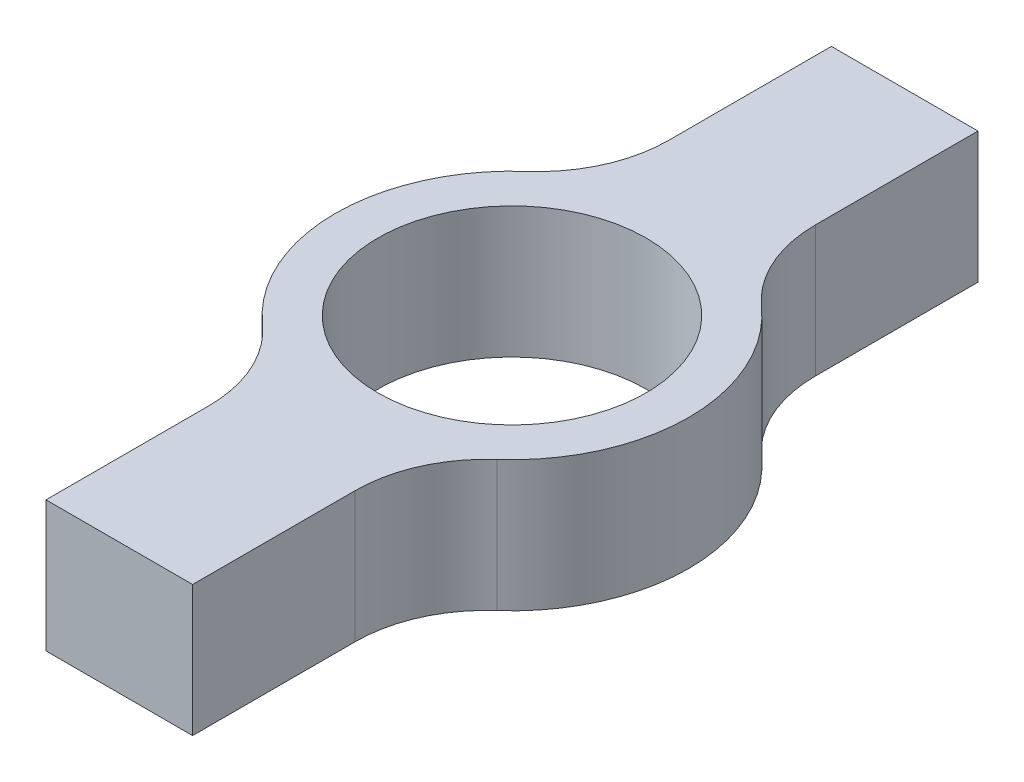
ISO-10303-21;
HEADER;
FILE_DESCRIPTION(('STEP AP214'),'2;1');
FILE_NAME('part.step','',(''),(''),'','','');
FILE_SCHEMA(('AUTOMOTIVE_DESIGN { 1 0 10303 214 1 1 1 1 }'));
ENDSEC;
DATA;
#1=APPLICATION_CONTEXT('core data for automotive mechanical design processes');
#2=APPLICATION_PROTOCOL_DEFINITION('international standard','automotive_design',2000,#1);
#3=PRODUCT_CONTEXT('',#1,'mechanical');
#4=PRODUCT('Part','Part','',(#3));
#5=PRODUCT_RELATED_PRODUCT_CATEGORY('part','',(#4));
#6=PRODUCT_DEFINITION_FORMATION('','',#4);
#7=PRODUCT_DEFINITION_CONTEXT('part definition',#1,'design');
#8=PRODUCT_DEFINITION('design','',#6,#7);
#9=PRODUCT_DEFINITION_SHAPE('','',#8);
#10=(LENGTH_UNIT() NAMED_UNIT(*) SI_UNIT(.MILLI.,.METRE.));
#11=(NAMED_UNIT(*) PLANE_ANGLE_UNIT() SI_UNIT($,.RADIAN.));
#12=(NAMED_UNIT(*) SI_UNIT($,.STERADIAN.) SOLID_ANGLE_UNIT());
#13=UNCERTAINTY_MEASURE_WITH_UNIT(LENGTH_MEASURE(1.E-05),#10,'distance_accuracy_value','');
#14=(GEOMETRIC_REPRESENTATION_CONTEXT(3) GLOBAL_UNCERTAINTY_ASSIGNED_CONTEXT((#13)) GLOBAL_UNIT_ASSIGNED_CONTEXT((#10,
#11,#12)) REPRESENTATION_CONTEXT('',''));
#15=CARTESIAN_POINT('',(0.,0.,0.));
#16=DIRECTION('',(0.,0.,1.));
#17=DIRECTION('',(1.,0.,0.));
#18=AXIS2_PLACEMENT_3D('',#15,#16,#17);
#19=CARTESIAN_POINT('',(0.,10.,0.));
#20=DIRECTION('',(0.,-1.,0.));
#21=DIRECTION('',(0.,0.,-1.));
#22=AXIS2_PLACEMENT_3D('',#19,#20,#21);
#23=CYLINDRICAL_SURFACE('',#22,13.5);
#24=CARTESIAN_POINT('',(0.,0.,0.));
#25=DIRECTION('',(0.,1.,0.));
#26=DIRECTION('',(0.,0.,1.));
#27=AXIS2_PLACEMENT_3D('',#24,#25,#26);
#28=CIRCLE('',#27,13.5);
#29=CARTESIAN_POINT('',(-8.96170212765957,0.,-10.0964298133103));
#30=VERTEX_POINT('',#29);
#31=CARTESIAN_POINT('',(-8.96170212765957,0.,10.0964298133103));
#32=VERTEX_POINT('',#31);
#33=EDGE_CURVE('E170',#30,#32,#28,.T.);
#34=ORIENTED_EDGE('',*,*,#33,.T.);
#35=DIRECTION('',(0.,-1.,0.));
#36=VECTOR('',#35,1.);
#37=CARTESIAN_POINT('',(-8.96170212765957,10.,10.0964298133103));
#38=LINE('',#37,#36);
#39=CARTESIAN_POINT('',(-8.96170212765957,10.,10.0964298133103));
#40=VERTEX_POINT('',#39);
#41=EDGE_CURVE('E195',#32,#40,#38,.F.);
#42=ORIENTED_EDGE('',*,*,#41,.T.);
#43=CARTESIAN_POINT('',(0.,10.,0.));
#44=DIRECTION('',(0.,1.,0.));
#45=DIRECTION('',(0.,0.,1.));
#46=AXIS2_PLACEMENT_3D('',#43,#44,#45);
#47=CIRCLE('',#46,13.5);
#48=CARTESIAN_POINT('',(-8.96170212765957,10.,-10.0964298133103));
#49=VERTEX_POINT('',#48);
#50=EDGE_CURVE('E175',#49,#40,#47,.T.);
#51=ORIENTED_EDGE('',*,*,#50,.F.);
#52=DIRECTION('',(0.,-1.,0.));
#53=VECTOR('',#52,1.);
#54=CARTESIAN_POINT('',(-8.96170212765957,10.,-10.0964298133103));
#55=LINE('',#54,#53);
#56=EDGE_CURVE('E192',#49,#30,#55,.T.);
#57=ORIENTED_EDGE('',*,*,#56,.T.);
#58=EDGE_LOOP('',(#34,#42,#51,#57));
#59=FACE_BOUND('',#58,.T.);
#60=ADVANCED_FACE('F35',(#59),#23,.T.);
#61=CARTESIAN_POINT('',(8.96170212765958,0.,10.0964298133103));
#62=VERTEX_POINT('',#61);
#63=CARTESIAN_POINT('',(8.96170212765958,0.,-10.0964298133103));
#64=VERTEX_POINT('',#63);
#65=EDGE_CURVE('E179',#62,#64,#28,.T.);
#66=ORIENTED_EDGE('',*,*,#65,.T.);
#67=DIRECTION('',(0.,-1.,0.));
#68=VECTOR('',#67,1.);
#69=CARTESIAN_POINT('',(8.96170212765958,10.,-10.0964298133103));
#70=LINE('',#69,#68);
#71=CARTESIAN_POINT('',(8.96170212765958,10.,-10.0964298133103));
#72=VERTEX_POINT('',#71);
#73=EDGE_CURVE('E185',#64,#72,#70,.F.);
#74=ORIENTED_EDGE('',*,*,#73,.T.);
#75=CARTESIAN_POINT('',(8.96170212765958,10.,10.0964298133103));
#76=VERTEX_POINT('',#75);
#77=EDGE_CURVE('E178',#76,#72,#47,.T.);
#78=ORIENTED_EDGE('',*,*,#77,.F.);
#79=DIRECTION('',(0.,-1.,0.));
#80=VECTOR('',#79,1.);
#81=CARTESIAN_POINT('',(8.96170212765958,10.,10.0964298133103));
#82=LINE('',#81,#80);
#83=EDGE_CURVE('E182',#76,#62,#82,.T.);
#84=ORIENTED_EDGE('',*,*,#83,.T.);
#85=EDGE_LOOP('',(#66,#74,#78,#84));
#86=FACE_BOUND('',#85,.T.);
#87=ADVANCED_FACE('F231',(#86),#23,.T.);
#88=CARTESIAN_POINT('',(0.,10.,0.));
#89=DIRECTION('',(0.,1.,0.));
#90=DIRECTION('',(0.,0.,1.));
#91=AXIS2_PLACEMENT_3D('',#88,#89,#90);
#92=PLANE('',#91);
#93=CARTESIAN_POINT('',(0.,10.,0.));
#94=DIRECTION('',(0.,1.,0.));
#95=DIRECTION('',(0.,0.,1.));
#96=AXIS2_PLACEMENT_3D('',#93,#94,#95);
#97=CIRCLE('',#96,10.25);
#98=CARTESIAN_POINT('',(0.,10.,10.25));
#99=VERTEX_POINT('',#98);
#100=EDGE_CURVE('E221',#99,#99,#97,.T.);
#101=ORIENTED_EDGE('',*,*,#100,.F.);
#102=EDGE_LOOP('',(#101));
#103=FACE_BOUND('',#102,.T.);
#104=DIRECTION('',(0.,0.,-1.));
#105=VECTOR('',#104,1.);
#106=CARTESIAN_POINT('',(5.6,10.,-30.));
#107=LINE('',#106,#105);
#108=CARTESIAN_POINT('',(5.60000000000001,10.,30.));
#109=VERTEX_POINT('',#108);
#110=CARTESIAN_POINT('',(5.60000000000001,10.,17.5752667120587));
#111=VERTEX_POINT('',#110);
#112=EDGE_CURVE('E163',#109,#111,#107,.T.);
#113=ORIENTED_EDGE('',*,*,#112,.T.);
#114=CARTESIAN_POINT('',(15.6,10.,17.5752667120587));
#115=DIRECTION('',(0.,1.,0.));
#116=DIRECTION('',(0.,0.,1.));
#117=AXIS2_PLACEMENT_3D('',#114,#115,#116);
#118=CIRCLE('',#117,10.);
#119=EDGE_CURVE('E206',#111,#76,#118,.F.);
#120=ORIENTED_EDGE('',*,*,#119,.T.);
#121=ORIENTED_EDGE('',*,*,#77,.T.);
#122=CARTESIAN_POINT('',(15.6,10.,-17.5752667120587));
#123=DIRECTION('',(0.,1.,0.));
#124=DIRECTION('',(0.,0.,1.));
#125=AXIS2_PLACEMENT_3D('',#122,#123,#124);
#126=CIRCLE('',#125,10.);
#127=CARTESIAN_POINT('',(5.6,10.,-17.5752667120587));
#128=VERTEX_POINT('',#127);
#129=EDGE_CURVE('E200',#72,#128,#126,.F.);
#130=ORIENTED_EDGE('',*,*,#129,.T.);
#131=CARTESIAN_POINT('',(5.6,10.,-30.));
#132=VERTEX_POINT('',#131);
#133=EDGE_CURVE('E162',#128,#132,#107,.T.);
#134=ORIENTED_EDGE('',*,*,#133,.T.);
#135=DIRECTION('',(-1.,0.,0.));
#136=VECTOR('',#135,1.);
#137=CARTESIAN_POINT('',(-5.6,10.,-30.));
#138=LINE('',#137,#136);
#139=CARTESIAN_POINT('',(-5.6,10.,-30.));
#140=VERTEX_POINT('',#139);
#141=EDGE_CURVE('E135',#132,#140,#138,.T.);
#142=ORIENTED_EDGE('',*,*,#141,.T.);
#143=DIRECTION('',(0.,0.,1.));
#144=VECTOR('',#143,1.);
#145=CARTESIAN_POINT('',(-5.6,10.,-30.));
#146=LINE('',#145,#144);
#147=CARTESIAN_POINT('',(-5.6,10.,-17.5752667120587));
#148=VERTEX_POINT('',#147);
#149=EDGE_CURVE('E158',#140,#148,#146,.T.);
#150=ORIENTED_EDGE('',*,*,#149,.T.);
#151=CARTESIAN_POINT('',(-15.6,10.,-17.5752667120587));
#152=DIRECTION('',(0.,1.,0.));
#153=DIRECTION('',(0.,0.,1.));
#154=AXIS2_PLACEMENT_3D('',#151,#152,#153);
#155=CIRCLE('',#154,10.);
#156=EDGE_CURVE('E11',#148,#49,#155,.F.);
#157=ORIENTED_EDGE('',*,*,#156,.T.);
#158=ORIENTED_EDGE('',*,*,#50,.T.);
#159=CARTESIAN_POINT('',(-15.6,10.,17.5752667120587));
#160=DIRECTION('',(0.,1.,0.));
#161=DIRECTION('',(0.,0.,1.));
#162=AXIS2_PLACEMENT_3D('',#159,#160,#161);
#163=CIRCLE('',#162,10.);
#164=CARTESIAN_POINT('',(-5.59999999999999,10.,17.5752667120588));
#165=VERTEX_POINT('',#164);
#166=EDGE_CURVE('E208',#40,#165,#163,.F.);
#167=ORIENTED_EDGE('',*,*,#166,.T.);
#168=CARTESIAN_POINT('',(-5.59999999999999,10.,30.));
#169=VERTEX_POINT('',#168);
#170=EDGE_CURVE('E160',#165,#169,#146,.T.);
#171=ORIENTED_EDGE('',*,*,#170,.T.);
#172=DIRECTION('',(1.,0.,0.));
#173=VECTOR('',#172,1.);
#174=CARTESIAN_POINT('',(-5.59999999999999,10.,30.));
#175=LINE('',#174,#173);
#176=EDGE_CURVE('E142',#169,#109,#175,.T.);
#177=ORIENTED_EDGE('',*,*,#176,.T.);
#178=EDGE_LOOP('',(#113,#120,#121,#130,#134,#142,#150,#157,#158,#167,#171,#177));
#179=FACE_BOUND('',#178,.T.);
#180=ADVANCED_FACE('F218',(#103,#179),#92,.T.);
#181=CARTESIAN_POINT('',(0.,0.,0.));
#182=DIRECTION('',(0.,1.,0.));
#183=DIRECTION('',(0.,0.,1.));
#184=AXIS2_PLACEMENT_3D('',#181,#182,#183);
#185=PLANE('',#184);
#186=CARTESIAN_POINT('',(0.,0.,0.));
#187=DIRECTION('',(0.,1.,0.));
#188=DIRECTION('',(0.,0.,1.));
#189=AXIS2_PLACEMENT_3D('',#186,#187,#188);
#190=CIRCLE('',#189,10.25);
#191=CARTESIAN_POINT('',(0.,0.,10.25));
#192=VERTEX_POINT('',#191);
#193=EDGE_CURVE('E219',#192,#192,#190,.T.);
#194=ORIENTED_EDGE('',*,*,#193,.T.);
#195=EDGE_LOOP('',(#194));
#196=FACE_BOUND('',#195,.T.);
#197=ORIENTED_EDGE('',*,*,#65,.F.);
#198=CARTESIAN_POINT('',(15.6,0.,17.5752667120587));
#199=DIRECTION('',(0.,1.,0.));
#200=DIRECTION('',(0.,0.,1.));
#201=AXIS2_PLACEMENT_3D('',#198,#199,#200);
#202=CIRCLE('',#201,10.);
#203=CARTESIAN_POINT('',(5.60000000000001,0.,17.5752667120587));
#204=VERTEX_POINT('',#203);
#205=EDGE_CURVE('E204',#62,#204,#202,.T.);
#206=ORIENTED_EDGE('',*,*,#205,.T.);
#207=DIRECTION('',(0.,0.,-1.));
#208=VECTOR('',#207,1.);
#209=CARTESIAN_POINT('',(5.6,0.,-30.));
#210=LINE('',#209,#208);
#211=CARTESIAN_POINT('',(5.60000000000001,0.,30.));
#212=VERTEX_POINT('',#211);
#213=EDGE_CURVE('E150',#212,#204,#210,.T.);
#214=ORIENTED_EDGE('',*,*,#213,.F.);
#215=DIRECTION('',(1.,0.,0.));
#216=VECTOR('',#215,1.);
#217=CARTESIAN_POINT('',(-5.59999999999999,0.,30.));
#218=LINE('',#217,#216);
#219=CARTESIAN_POINT('',(-5.59999999999999,0.,30.));
#220=VERTEX_POINT('',#219);
#221=EDGE_CURVE('E140',#220,#212,#218,.T.);
#222=ORIENTED_EDGE('',*,*,#221,.F.);
#223=DIRECTION('',(0.,0.,1.));
#224=VECTOR('',#223,1.);
#225=CARTESIAN_POINT('',(-5.6,0.,-30.));
#226=LINE('',#225,#224);
#227=CARTESIAN_POINT('',(-5.59999999999999,0.,17.5752667120588));
#228=VERTEX_POINT('',#227);
#229=EDGE_CURVE('E124',#228,#220,#226,.T.);
#230=ORIENTED_EDGE('',*,*,#229,.F.);
#231=CARTESIAN_POINT('',(-15.6,0.,17.5752667120587));
#232=DIRECTION('',(0.,1.,0.));
#233=DIRECTION('',(0.,0.,1.));
#234=AXIS2_PLACEMENT_3D('',#231,#232,#233);
#235=CIRCLE('',#234,10.);
#236=EDGE_CURVE('E210',#228,#32,#235,.T.);
#237=ORIENTED_EDGE('',*,*,#236,.T.);
#238=ORIENTED_EDGE('',*,*,#33,.F.);
#239=CARTESIAN_POINT('',(-15.6,0.,-17.5752667120587));
#240=DIRECTION('',(0.,1.,0.));
#241=DIRECTION('',(0.,0.,1.));
#242=AXIS2_PLACEMENT_3D('',#239,#240,#241);
#243=CIRCLE('',#242,10.);
#244=CARTESIAN_POINT('',(-5.6,0.,-17.5752667120587));
#245=VERTEX_POINT('',#244);
#246=EDGE_CURVE('E43',#30,#245,#243,.T.);
#247=ORIENTED_EDGE('',*,*,#246,.T.);
#248=CARTESIAN_POINT('',(-5.6,0.,-30.));
#249=VERTEX_POINT('',#248);
#250=EDGE_CURVE('E134',#249,#245,#226,.T.);
#251=ORIENTED_EDGE('',*,*,#250,.F.);
#252=DIRECTION('',(-1.,0.,0.));
#253=VECTOR('',#252,1.);
#254=CARTESIAN_POINT('',(-5.6,0.,-30.));
#255=LINE('',#254,#253);
#256=CARTESIAN_POINT('',(5.6,0.,-30.));
#257=VERTEX_POINT('',#256);
#258=EDGE_CURVE('E144',#257,#249,#255,.T.);
#259=ORIENTED_EDGE('',*,*,#258,.F.);
#260=CARTESIAN_POINT('',(5.6,0.,-17.5752667120587));
#261=VERTEX_POINT('',#260);
#262=EDGE_CURVE('E151',#261,#257,#210,.T.);
#263=ORIENTED_EDGE('',*,*,#262,.F.);
#264=CARTESIAN_POINT('',(15.6,0.,-17.5752667120587));
#265=DIRECTION('',(0.,1.,0.));
#266=DIRECTION('',(0.,0.,1.));
#267=AXIS2_PLACEMENT_3D('',#264,#265,#266);
#268=CIRCLE('',#267,10.);
#269=EDGE_CURVE('E202',#261,#64,#268,.T.);
#270=ORIENTED_EDGE('',*,*,#269,.T.);
#271=EDGE_LOOP('',(#197,#206,#214,#222,#230,#237,#238,#247,#251,#259,#263,#270));
#272=FACE_BOUND('',#271,.T.);
#273=ADVANCED_FACE('F148',(#196,#272),#185,.F.);
#274=CARTESIAN_POINT('',(-5.59999999999999,0.,30.));
#275=DIRECTION('',(0.,0.,1.));
#276=DIRECTION('',(1.,0.,0.));
#277=AXIS2_PLACEMENT_3D('',#274,#275,#276);
#278=PLANE('',#277);
#279=ORIENTED_EDGE('',*,*,#176,.F.);
#280=DIRECTION('',(0.,1.,0.));
#281=VECTOR('',#280,1.);
#282=CARTESIAN_POINT('',(-5.59999999999999,0.,30.));
#283=LINE('',#282,#281);
#284=EDGE_CURVE('E128',#220,#169,#283,.T.);
#285=ORIENTED_EDGE('',*,*,#284,.F.);
#286=ORIENTED_EDGE('',*,*,#221,.T.);
#287=DIRECTION('',(0.,1.,0.));
#288=VECTOR('',#287,1.);
#289=CARTESIAN_POINT('',(5.60000000000001,0.,30.));
#290=LINE('',#289,#288);
#291=EDGE_CURVE('E143',#212,#109,#290,.T.);
#292=ORIENTED_EDGE('',*,*,#291,.T.);
#293=EDGE_LOOP('',(#279,#285,#286,#292));
#294=FACE_BOUND('',#293,.T.);
#295=ADVANCED_FACE('F139',(#294),#278,.T.);
#296=CARTESIAN_POINT('',(5.6,0.,-30.));
#297=DIRECTION('',(1.,0.,0.));
#298=DIRECTION('',(0.,0.,-1.));
#299=AXIS2_PLACEMENT_3D('',#296,#297,#298);
#300=PLANE('',#299);
#301=ORIENTED_EDGE('',*,*,#213,.T.);
#302=DIRECTION('',(0.,-1.,0.));
#303=VECTOR('',#302,1.);
#304=CARTESIAN_POINT('',(5.60000000000001,0.,17.5752667120587));
#305=LINE('',#304,#303);
#306=EDGE_CURVE('E190',#204,#111,#305,.F.);
#307=ORIENTED_EDGE('',*,*,#306,.T.);
#308=ORIENTED_EDGE('',*,*,#112,.F.);
#309=ORIENTED_EDGE('',*,*,#291,.F.);
#310=EDGE_LOOP('',(#301,#307,#308,#309));
#311=FACE_BOUND('',#310,.T.);
#312=ADVANCED_FACE('F281',(#311),#300,.T.);
#313=CARTESIAN_POINT('',(-5.6,0.,-30.));
#314=DIRECTION('',(-1.,0.,0.));
#315=DIRECTION('',(0.,0.,1.));
#316=AXIS2_PLACEMENT_3D('',#313,#314,#315);
#317=PLANE('',#316);
#318=ORIENTED_EDGE('',*,*,#170,.F.);
#319=DIRECTION('',(0.,-1.,0.));
#320=VECTOR('',#319,1.);
#321=CARTESIAN_POINT('',(-5.59999999999999,0.,17.5752667120588));
#322=LINE('',#321,#320);
#323=EDGE_CURVE('E131',#165,#228,#322,.T.);
#324=ORIENTED_EDGE('',*,*,#323,.T.);
#325=ORIENTED_EDGE('',*,*,#229,.T.);
#326=ORIENTED_EDGE('',*,*,#284,.T.);
#327=EDGE_LOOP('',(#318,#324,#325,#326));
#328=FACE_BOUND('',#327,.T.);
#329=ADVANCED_FACE('F127',(#328),#317,.T.);
#330=ORIENTED_EDGE('',*,*,#250,.T.);
#331=DIRECTION('',(0.,-1.,0.));
#332=VECTOR('',#331,1.);
#333=CARTESIAN_POINT('',(-5.6,0.,-17.5752667120587));
#334=LINE('',#333,#332);
#335=EDGE_CURVE('E56',#245,#148,#334,.F.);
#336=ORIENTED_EDGE('',*,*,#335,.T.);
#337=ORIENTED_EDGE('',*,*,#149,.F.);
#338=DIRECTION('',(0.,1.,0.));
#339=VECTOR('',#338,1.);
#340=CARTESIAN_POINT('',(-5.6,0.,-30.));
#341=LINE('',#340,#339);
#342=EDGE_CURVE('E168',#249,#140,#341,.T.);
#343=ORIENTED_EDGE('',*,*,#342,.F.);
#344=EDGE_LOOP('',(#330,#336,#337,#343));
#345=FACE_BOUND('',#344,.T.);
#346=ADVANCED_FACE('F261',(#345),#317,.T.);
#347=ORIENTED_EDGE('',*,*,#133,.F.);
#348=DIRECTION('',(0.,-1.,0.));
#349=VECTOR('',#348,1.);
#350=CARTESIAN_POINT('',(5.6,0.,-17.5752667120587));
#351=LINE('',#350,#349);
#352=EDGE_CURVE('E188',#128,#261,#351,.T.);
#353=ORIENTED_EDGE('',*,*,#352,.T.);
#354=ORIENTED_EDGE('',*,*,#262,.T.);
#355=DIRECTION('',(0.,1.,0.));
#356=VECTOR('',#355,1.);
#357=CARTESIAN_POINT('',(5.6,0.,-30.));
#358=LINE('',#357,#356);
#359=EDGE_CURVE('E171',#257,#132,#358,.T.);
#360=ORIENTED_EDGE('',*,*,#359,.T.);
#361=EDGE_LOOP('',(#347,#353,#354,#360));
#362=FACE_BOUND('',#361,.T.);
#363=ADVANCED_FACE('F269',(#362),#300,.T.);
#364=CARTESIAN_POINT('',(-5.6,0.,-30.));
#365=DIRECTION('',(0.,0.,-1.));
#366=DIRECTION('',(-1.,0.,0.));
#367=AXIS2_PLACEMENT_3D('',#364,#365,#366);
#368=PLANE('',#367);
#369=ORIENTED_EDGE('',*,*,#141,.F.);
#370=ORIENTED_EDGE('',*,*,#359,.F.);
#371=ORIENTED_EDGE('',*,*,#258,.T.);
#372=ORIENTED_EDGE('',*,*,#342,.T.);
#373=EDGE_LOOP('',(#369,#370,#371,#372));
#374=FACE_BOUND('',#373,.T.);
#375=ADVANCED_FACE('F266',(#374),#368,.T.);
#376=CARTESIAN_POINT('',(0.,0.,0.));
#377=DIRECTION('',(0.,1.,0.));
#378=DIRECTION('',(0.,0.,1.));
#379=AXIS2_PLACEMENT_3D('',#376,#377,#378);
#380=CYLINDRICAL_SURFACE('',#379,10.25);
#381=ORIENTED_EDGE('',*,*,#193,.F.);
#382=EDGE_LOOP('',(#381));
#383=FACE_BOUND('',#382,.T.);
#384=ORIENTED_EDGE('',*,*,#100,.T.);
#385=EDGE_LOOP('',(#384));
#386=FACE_BOUND('',#385,.T.);
#387=ADVANCED_FACE('F228',(#383,#386),#380,.F.);
#388=CARTESIAN_POINT('',(15.6,10.,-17.5752667120587));
#389=DIRECTION('',(0.,-1.,0.));
#390=DIRECTION('',(0.,0.,-1.));
#391=AXIS2_PLACEMENT_3D('',#388,#389,#390);
#392=CYLINDRICAL_SURFACE('',#391,10.);
#393=ORIENTED_EDGE('',*,*,#269,.F.);
#394=ORIENTED_EDGE('',*,*,#352,.F.);
#395=ORIENTED_EDGE('',*,*,#129,.F.);
#396=ORIENTED_EDGE('',*,*,#73,.F.);
#397=EDGE_LOOP('',(#393,#394,#395,#396));
#398=FACE_BOUND('',#397,.T.);
#399=ADVANCED_FACE('F245',(#398),#392,.F.);
#400=CARTESIAN_POINT('',(15.6,10.,17.5752667120587));
#401=DIRECTION('',(0.,-1.,0.));
#402=DIRECTION('',(0.,0.,-1.));
#403=AXIS2_PLACEMENT_3D('',#400,#401,#402);
#404=CYLINDRICAL_SURFACE('',#403,10.);
#405=ORIENTED_EDGE('',*,*,#119,.F.);
#406=ORIENTED_EDGE('',*,*,#306,.F.);
#407=ORIENTED_EDGE('',*,*,#205,.F.);
#408=ORIENTED_EDGE('',*,*,#83,.F.);
#409=EDGE_LOOP('',(#405,#406,#407,#408));
#410=FACE_BOUND('',#409,.T.);
#411=ADVANCED_FACE('F248',(#410),#404,.F.);
#412=CARTESIAN_POINT('',(-15.6,10.,17.5752667120587));
#413=DIRECTION('',(0.,-1.,0.));
#414=DIRECTION('',(0.,0.,-1.));
#415=AXIS2_PLACEMENT_3D('',#412,#413,#414);
#416=CYLINDRICAL_SURFACE('',#415,10.);
#417=ORIENTED_EDGE('',*,*,#236,.F.);
#418=ORIENTED_EDGE('',*,*,#323,.F.);
#419=ORIENTED_EDGE('',*,*,#166,.F.);
#420=ORIENTED_EDGE('',*,*,#41,.F.);
#421=EDGE_LOOP('',(#417,#418,#419,#420));
#422=FACE_BOUND('',#421,.T.);
#423=ADVANCED_FACE('F216',(#422),#416,.F.);
#424=CARTESIAN_POINT('',(-15.6,10.,-17.5752667120587));
#425=DIRECTION('',(0.,-1.,0.));
#426=DIRECTION('',(0.,0.,-1.));
#427=AXIS2_PLACEMENT_3D('',#424,#425,#426);
#428=CYLINDRICAL_SURFACE('',#427,10.);
#429=ORIENTED_EDGE('',*,*,#156,.F.);
#430=ORIENTED_EDGE('',*,*,#335,.F.);
#431=ORIENTED_EDGE('',*,*,#246,.F.);
#432=ORIENTED_EDGE('',*,*,#56,.F.);
#433=EDGE_LOOP('',(#429,#430,#431,#432));
#434=FACE_BOUND('',#433,.T.);
#435=ADVANCED_FACE('F37',(#434),#428,.F.);
#436=CLOSED_SHELL('',(#60,#87,#180,#273,#295,#312,#329,#346,#363,#375,#387,#399,#411,#423,#435));
#437=MANIFOLD_SOLID_BREP('B2',#436);
#438=ADVANCED_BREP_SHAPE_REPRESENTATION('',(#18,#437),#14);
#439=SHAPE_DEFINITION_REPRESENTATION(#9,#438);
ENDSEC;
END-ISO-10303-21;
